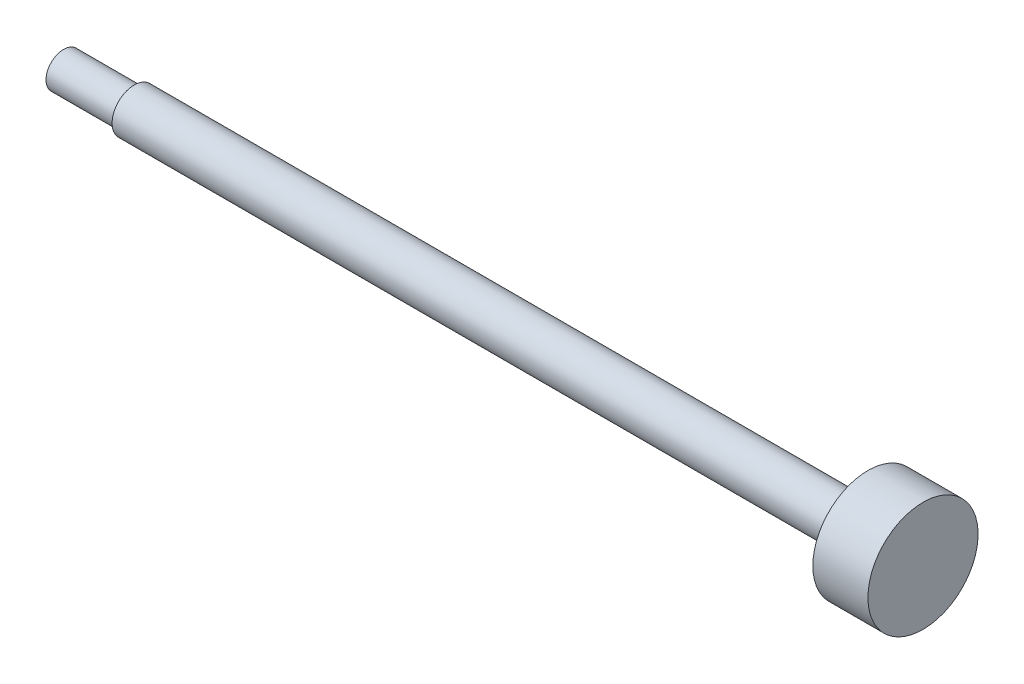
ISO-10303-21;
HEADER;
FILE_DESCRIPTION(('STEP AP214'),'2;1');
FILE_NAME('part.step','',(''),(''),'','','');
FILE_SCHEMA(('AUTOMOTIVE_DESIGN { 1 0 10303 214 1 1 1 1 }'));
ENDSEC;
DATA;
#1=APPLICATION_CONTEXT('core data for automotive mechanical design processes');
#2=APPLICATION_PROTOCOL_DEFINITION('international standard','automotive_design',2000,#1);
#3=PRODUCT_CONTEXT('',#1,'mechanical');
#4=PRODUCT('Part','Part','',(#3));
#5=PRODUCT_RELATED_PRODUCT_CATEGORY('part','',(#4));
#6=PRODUCT_DEFINITION_FORMATION('','',#4);
#7=PRODUCT_DEFINITION_CONTEXT('part definition',#1,'design');
#8=PRODUCT_DEFINITION('design','',#6,#7);
#9=PRODUCT_DEFINITION_SHAPE('','',#8);
#10=(LENGTH_UNIT() NAMED_UNIT(*) SI_UNIT(.MILLI.,.METRE.));
#11=(NAMED_UNIT(*) PLANE_ANGLE_UNIT() SI_UNIT($,.RADIAN.));
#12=(NAMED_UNIT(*) SI_UNIT($,.STERADIAN.) SOLID_ANGLE_UNIT());
#13=UNCERTAINTY_MEASURE_WITH_UNIT(LENGTH_MEASURE(1.E-05),#10,'distance_accuracy_value','');
#14=(GEOMETRIC_REPRESENTATION_CONTEXT(3) GLOBAL_UNCERTAINTY_ASSIGNED_CONTEXT((#13)) GLOBAL_UNIT_ASSIGNED_CONTEXT((#10,
#11,#12)) REPRESENTATION_CONTEXT('',''));
#15=CARTESIAN_POINT('',(0.,0.,0.));
#16=DIRECTION('',(0.,0.,1.));
#17=DIRECTION('',(1.,0.,0.));
#18=AXIS2_PLACEMENT_3D('',#15,#16,#17);
#19=CARTESIAN_POINT('',(0.,0.,0.));
#20=DIRECTION('',(1.,0.,0.));
#21=DIRECTION('',(0.,0.,-1.));
#22=AXIS2_PLACEMENT_3D('',#19,#20,#21);
#23=PLANE('',#22);
#24=CARTESIAN_POINT('',(0.,0.,0.));
#25=DIRECTION('',(-1.,0.,0.));
#26=DIRECTION('',(0.,0.,1.));
#27=AXIS2_PLACEMENT_3D('',#24,#25,#26);
#28=CIRCLE('',#27,8.);
#29=CARTESIAN_POINT('',(0.,0.,8.));
#30=VERTEX_POINT('',#29);
#31=EDGE_CURVE('E10',#30,#30,#28,.T.);
#32=ORIENTED_EDGE('',*,*,#31,.T.);
#33=EDGE_LOOP('',(#32));
#34=FACE_BOUND('',#33,.T.);
#35=ADVANCED_FACE('F31',(#34),#23,.F.);
#36=CARTESIAN_POINT('',(0.,0.,0.));
#37=DIRECTION('',(-1.,0.,0.));
#38=DIRECTION('',(0.,0.,1.));
#39=AXIS2_PLACEMENT_3D('',#36,#37,#38);
#40=CYLINDRICAL_SURFACE('',#39,8.);
#41=ORIENTED_EDGE('',*,*,#31,.F.);
#42=EDGE_LOOP('',(#41));
#43=FACE_BOUND('',#42,.T.);
#44=CARTESIAN_POINT('',(32.,0.,0.));
#45=DIRECTION('',(-1.,0.,0.));
#46=DIRECTION('',(0.,0.,1.));
#47=AXIS2_PLACEMENT_3D('',#44,#45,#46);
#48=CIRCLE('',#47,8.);
#49=CARTESIAN_POINT('',(32.,0.,8.));
#50=VERTEX_POINT('',#49);
#51=EDGE_CURVE('E37',#50,#50,#48,.T.);
#52=ORIENTED_EDGE('',*,*,#51,.T.);
#53=EDGE_LOOP('',(#52));
#54=FACE_BOUND('',#53,.T.);
#55=ADVANCED_FACE('F69',(#43,#54),#40,.T.);
#56=CARTESIAN_POINT('',(32.,8.,0.));
#57=DIRECTION('',(1.,0.,0.));
#58=DIRECTION('',(0.,0.,-1.));
#59=AXIS2_PLACEMENT_3D('',#56,#57,#58);
#60=PLANE('',#59);
#61=ORIENTED_EDGE('',*,*,#51,.F.);
#62=EDGE_LOOP('',(#61));
#63=FACE_BOUND('',#62,.T.);
#64=CARTESIAN_POINT('',(32.,0.,0.));
#65=DIRECTION('',(-1.,0.,0.));
#66=DIRECTION('',(0.,0.,1.));
#67=AXIS2_PLACEMENT_3D('',#64,#65,#66);
#68=CIRCLE('',#67,9.99999999999998);
#69=CARTESIAN_POINT('',(32.,0.,9.99999999999998));
#70=VERTEX_POINT('',#69);
#71=EDGE_CURVE('E41',#70,#70,#68,.T.);
#72=ORIENTED_EDGE('',*,*,#71,.T.);
#73=EDGE_LOOP('',(#72));
#74=FACE_BOUND('',#73,.T.);
#75=ADVANCED_FACE('F73',(#63,#74),#60,.F.);
#76=CARTESIAN_POINT('',(0.,0.,0.));
#77=DIRECTION('',(-1.,0.,0.));
#78=DIRECTION('',(0.,0.,1.));
#79=AXIS2_PLACEMENT_3D('',#76,#77,#78);
#80=CYLINDRICAL_SURFACE('',#79,9.99999999999997);
#81=ORIENTED_EDGE('',*,*,#71,.F.);
#82=EDGE_LOOP('',(#81));
#83=FACE_BOUND('',#82,.T.);
#84=CARTESIAN_POINT('',(365.,0.,0.));
#85=DIRECTION('',(-1.,0.,0.));
#86=DIRECTION('',(0.,0.,1.));
#87=AXIS2_PLACEMENT_3D('',#84,#85,#86);
#88=CIRCLE('',#87,9.99999999999997);
#89=CARTESIAN_POINT('',(365.,0.,9.99999999999997));
#90=VERTEX_POINT('',#89);
#91=EDGE_CURVE('E45',#90,#90,#88,.T.);
#92=ORIENTED_EDGE('',*,*,#91,.T.);
#93=EDGE_LOOP('',(#92));
#94=FACE_BOUND('',#93,.T.);
#95=ADVANCED_FACE('F78',(#83,#94),#80,.T.);
#96=CARTESIAN_POINT('',(365.,9.99999999999997,0.));
#97=DIRECTION('',(1.,0.,0.));
#98=DIRECTION('',(0.,0.,-1.));
#99=AXIS2_PLACEMENT_3D('',#96,#97,#98);
#100=PLANE('',#99);
#101=ORIENTED_EDGE('',*,*,#91,.F.);
#102=EDGE_LOOP('',(#101));
#103=FACE_BOUND('',#102,.T.);
#104=CARTESIAN_POINT('',(365.,0.,0.));
#105=DIRECTION('',(-1.,0.,0.));
#106=DIRECTION('',(0.,0.,1.));
#107=AXIS2_PLACEMENT_3D('',#104,#105,#106);
#108=CIRCLE('',#107,25.);
#109=CARTESIAN_POINT('',(365.,0.,25.));
#110=VERTEX_POINT('',#109);
#111=EDGE_CURVE('E50',#110,#110,#108,.T.);
#112=ORIENTED_EDGE('',*,*,#111,.T.);
#113=EDGE_LOOP('',(#112));
#114=FACE_BOUND('',#113,.T.);
#115=ADVANCED_FACE('F65',(#103,#114),#100,.F.);
#116=CARTESIAN_POINT('',(0.,0.,0.));
#117=DIRECTION('',(-1.,0.,0.));
#118=DIRECTION('',(0.,0.,1.));
#119=AXIS2_PLACEMENT_3D('',#116,#117,#118);
#120=CYLINDRICAL_SURFACE('',#119,25.);
#121=ORIENTED_EDGE('',*,*,#111,.F.);
#122=EDGE_LOOP('',(#121));
#123=FACE_BOUND('',#122,.T.);
#124=CARTESIAN_POINT('',(390.,0.,0.));
#125=DIRECTION('',(-1.,0.,0.));
#126=DIRECTION('',(0.,0.,1.));
#127=AXIS2_PLACEMENT_3D('',#124,#125,#126);
#128=CIRCLE('',#127,25.);
#129=CARTESIAN_POINT('',(390.,0.,25.));
#130=VERTEX_POINT('',#129);
#131=EDGE_CURVE('E53',#130,#130,#128,.T.);
#132=ORIENTED_EDGE('',*,*,#131,.T.);
#133=EDGE_LOOP('',(#132));
#134=FACE_BOUND('',#133,.T.);
#135=ADVANCED_FACE('F57',(#123,#134),#120,.T.);
#136=CARTESIAN_POINT('',(390.,25.,0.));
#137=DIRECTION('',(-1.,0.,0.));
#138=DIRECTION('',(0.,0.,1.));
#139=AXIS2_PLACEMENT_3D('',#136,#137,#138);
#140=PLANE('',#139);
#141=ORIENTED_EDGE('',*,*,#131,.F.);
#142=EDGE_LOOP('',(#141));
#143=FACE_BOUND('',#142,.T.);
#144=ADVANCED_FACE('F59',(#143),#140,.F.);
#145=CLOSED_SHELL('',(#35,#55,#75,#95,#115,#135,#144));
#146=MANIFOLD_SOLID_BREP('B2',#145);
#147=ADVANCED_BREP_SHAPE_REPRESENTATION('',(#18,#146),#14);
#148=SHAPE_DEFINITION_REPRESENTATION(#9,#147);
ENDSEC;
END-ISO-10303-21;
